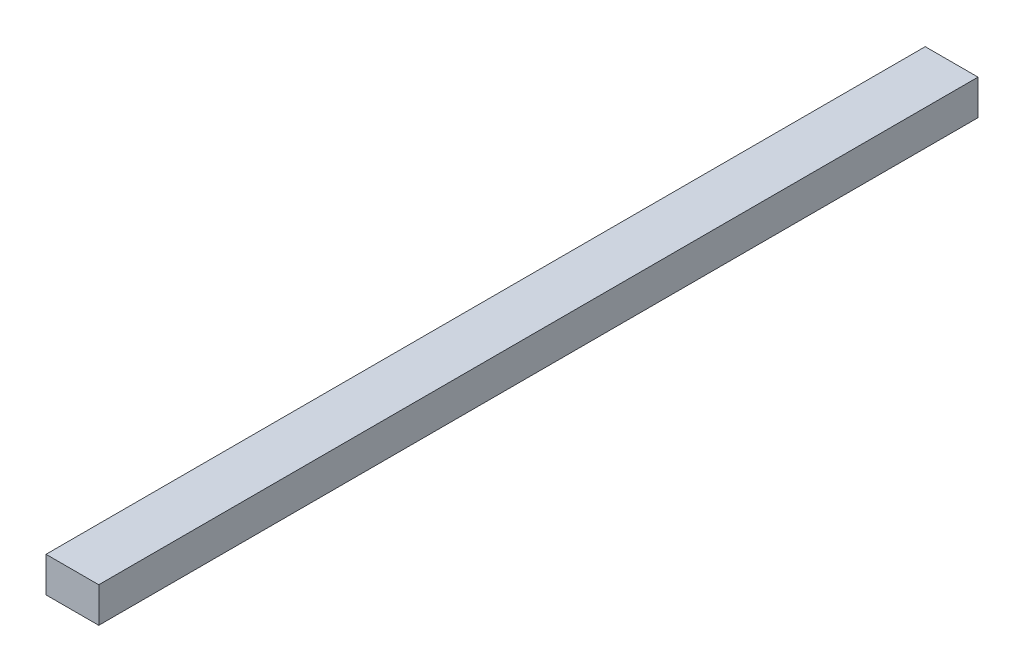
ISO-10303-21;
HEADER;
FILE_DESCRIPTION(('STEP AP214'),'2;1');
FILE_NAME('part.step','',(''),(''),'','','');
FILE_SCHEMA(('AUTOMOTIVE_DESIGN { 1 0 10303 214 1 1 1 1 }'));
ENDSEC;
DATA;
#1=APPLICATION_CONTEXT('core data for automotive mechanical design processes');
#2=APPLICATION_PROTOCOL_DEFINITION('international standard','automotive_design',2000,#1);
#3=PRODUCT_CONTEXT('',#1,'mechanical');
#4=PRODUCT('Part','Part','',(#3));
#5=PRODUCT_RELATED_PRODUCT_CATEGORY('part','',(#4));
#6=PRODUCT_DEFINITION_FORMATION('','',#4);
#7=PRODUCT_DEFINITION_CONTEXT('part definition',#1,'design');
#8=PRODUCT_DEFINITION('design','',#6,#7);
#9=PRODUCT_DEFINITION_SHAPE('','',#8);
#10=(LENGTH_UNIT() NAMED_UNIT(*) SI_UNIT(.MILLI.,.METRE.));
#11=(NAMED_UNIT(*) PLANE_ANGLE_UNIT() SI_UNIT($,.RADIAN.));
#12=(NAMED_UNIT(*) SI_UNIT($,.STERADIAN.) SOLID_ANGLE_UNIT());
#13=UNCERTAINTY_MEASURE_WITH_UNIT(LENGTH_MEASURE(1.E-05),#10,'distance_accuracy_value','');
#14=(GEOMETRIC_REPRESENTATION_CONTEXT(3) GLOBAL_UNCERTAINTY_ASSIGNED_CONTEXT((#13)) GLOBAL_UNIT_ASSIGNED_CONTEXT((#10,
#11,#12)) REPRESENTATION_CONTEXT('',''));
#15=CARTESIAN_POINT('',(0.,0.,0.));
#16=DIRECTION('',(0.,0.,1.));
#17=DIRECTION('',(1.,0.,0.));
#18=AXIS2_PLACEMENT_3D('',#15,#16,#17);
#19=CARTESIAN_POINT('',(-11.1196129400688,6.96774193548387,500.));
#20=DIRECTION('',(1.,0.,0.));
#21=DIRECTION('',(0.,1.,0.));
#22=AXIS2_PLACEMENT_3D('',#19,#20,#21);
#23=PLANE('',#22);
#24=DIRECTION('',(0.,-1.,0.));
#25=VECTOR('',#24,1.);
#26=CARTESIAN_POINT('',(-11.1196129400688,6.96774193548387,0.));
#27=LINE('',#26,#25);
#28=CARTESIAN_POINT('',(-11.1196129400688,6.96774193548387,0.));
#29=VERTEX_POINT('',#28);
#30=CARTESIAN_POINT('',(-11.1196129400688,-13.0322580645161,0.));
#31=VERTEX_POINT('',#30);
#32=EDGE_CURVE('E107',#29,#31,#27,.T.);
#33=ORIENTED_EDGE('',*,*,#32,.T.);
#34=DIRECTION('',(0.,0.,-1.));
#35=VECTOR('',#34,1.);
#36=CARTESIAN_POINT('',(-11.1196129400688,-13.0322580645161,500.));
#37=LINE('',#36,#35);
#38=CARTESIAN_POINT('',(-11.1196129400688,-13.0322580645161,500.));
#39=VERTEX_POINT('',#38);
#40=EDGE_CURVE('E11',#39,#31,#37,.T.);
#41=ORIENTED_EDGE('',*,*,#40,.F.);
#42=DIRECTION('',(0.,-1.,0.));
#43=VECTOR('',#42,1.);
#44=CARTESIAN_POINT('',(-11.1196129400688,6.96774193548387,500.));
#45=LINE('',#44,#43);
#46=CARTESIAN_POINT('',(-11.1196129400688,6.96774193548387,500.));
#47=VERTEX_POINT('',#46);
#48=EDGE_CURVE('E91',#47,#39,#45,.T.);
#49=ORIENTED_EDGE('',*,*,#48,.F.);
#50=DIRECTION('',(0.,0.,-1.));
#51=VECTOR('',#50,1.);
#52=CARTESIAN_POINT('',(-11.1196129400688,6.96774193548387,500.));
#53=LINE('',#52,#51);
#54=EDGE_CURVE('E103',#47,#29,#53,.T.);
#55=ORIENTED_EDGE('',*,*,#54,.T.);
#56=EDGE_LOOP('',(#33,#41,#49,#55));
#57=FACE_BOUND('',#56,.T.);
#58=ADVANCED_FACE('F39',(#57),#23,.F.);
#59=CARTESIAN_POINT('',(-11.1196129400688,-13.0322580645161,500.));
#60=DIRECTION('',(0.,1.,0.));
#61=DIRECTION('',(0.,0.,1.));
#62=AXIS2_PLACEMENT_3D('',#59,#60,#61);
#63=PLANE('',#62);
#64=DIRECTION('',(1.,0.,0.));
#65=VECTOR('',#64,1.);
#66=CARTESIAN_POINT('',(-11.1196129400688,-13.0322580645161,0.));
#67=LINE('',#66,#65);
#68=CARTESIAN_POINT('',(18.8803870599312,-13.0322580645161,0.));
#69=VERTEX_POINT('',#68);
#70=EDGE_CURVE('E96',#31,#69,#67,.T.);
#71=ORIENTED_EDGE('',*,*,#70,.T.);
#72=DIRECTION('',(0.,0.,-1.));
#73=VECTOR('',#72,1.);
#74=CARTESIAN_POINT('',(18.8803870599312,-13.0322580645161,500.));
#75=LINE('',#74,#73);
#76=CARTESIAN_POINT('',(18.8803870599312,-13.0322580645161,500.));
#77=VERTEX_POINT('',#76);
#78=EDGE_CURVE('E48',#77,#69,#75,.T.);
#79=ORIENTED_EDGE('',*,*,#78,.F.);
#80=DIRECTION('',(1.,0.,0.));
#81=VECTOR('',#80,1.);
#82=CARTESIAN_POINT('',(-11.1196129400688,-13.0322580645161,500.));
#83=LINE('',#82,#81);
#84=EDGE_CURVE('E86',#39,#77,#83,.T.);
#85=ORIENTED_EDGE('',*,*,#84,.F.);
#86=ORIENTED_EDGE('',*,*,#40,.T.);
#87=EDGE_LOOP('',(#71,#79,#85,#86));
#88=FACE_BOUND('',#87,.T.);
#89=ADVANCED_FACE('F95',(#88),#63,.F.);
#90=CARTESIAN_POINT('',(18.8803870599312,6.96774193548387,500.));
#91=DIRECTION('',(-1.,0.,0.));
#92=DIRECTION('',(0.,-1.,0.));
#93=AXIS2_PLACEMENT_3D('',#90,#91,#92);
#94=PLANE('',#93);
#95=DIRECTION('',(0.,1.,0.));
#96=VECTOR('',#95,1.);
#97=CARTESIAN_POINT('',(18.8803870599312,6.96774193548387,0.));
#98=LINE('',#97,#96);
#99=CARTESIAN_POINT('',(18.8803870599312,6.96774193548387,0.));
#100=VERTEX_POINT('',#99);
#101=EDGE_CURVE('E73',#69,#100,#98,.T.);
#102=ORIENTED_EDGE('',*,*,#101,.T.);
#103=DIRECTION('',(0.,0.,-1.));
#104=VECTOR('',#103,1.);
#105=CARTESIAN_POINT('',(18.8803870599312,6.96774193548387,500.));
#106=LINE('',#105,#104);
#107=CARTESIAN_POINT('',(18.8803870599312,6.96774193548387,500.));
#108=VERTEX_POINT('',#107);
#109=EDGE_CURVE('E98',#108,#100,#106,.T.);
#110=ORIENTED_EDGE('',*,*,#109,.F.);
#111=DIRECTION('',(0.,1.,0.));
#112=VECTOR('',#111,1.);
#113=CARTESIAN_POINT('',(18.8803870599312,6.96774193548387,500.));
#114=LINE('',#113,#112);
#115=EDGE_CURVE('E89',#77,#108,#114,.T.);
#116=ORIENTED_EDGE('',*,*,#115,.F.);
#117=ORIENTED_EDGE('',*,*,#78,.T.);
#118=EDGE_LOOP('',(#102,#110,#116,#117));
#119=FACE_BOUND('',#118,.T.);
#120=ADVANCED_FACE('F99',(#119),#94,.F.);
#121=CARTESIAN_POINT('',(-11.1196129400688,6.96774193548387,500.));
#122=DIRECTION('',(0.,-1.,0.));
#123=DIRECTION('',(0.,0.,-1.));
#124=AXIS2_PLACEMENT_3D('',#121,#122,#123);
#125=PLANE('',#124);
#126=DIRECTION('',(-1.,0.,0.));
#127=VECTOR('',#126,1.);
#128=CARTESIAN_POINT('',(-11.1196129400688,6.96774193548387,0.));
#129=LINE('',#128,#127);
#130=EDGE_CURVE('E79',#100,#29,#129,.T.);
#131=ORIENTED_EDGE('',*,*,#130,.T.);
#132=ORIENTED_EDGE('',*,*,#54,.F.);
#133=DIRECTION('',(-1.,0.,0.));
#134=VECTOR('',#133,1.);
#135=CARTESIAN_POINT('',(-11.1196129400688,6.96774193548387,500.));
#136=LINE('',#135,#134);
#137=EDGE_CURVE('E56',#108,#47,#136,.T.);
#138=ORIENTED_EDGE('',*,*,#137,.F.);
#139=ORIENTED_EDGE('',*,*,#109,.T.);
#140=EDGE_LOOP('',(#131,#132,#138,#139));
#141=FACE_BOUND('',#140,.T.);
#142=ADVANCED_FACE('F120',(#141),#125,.F.);
#143=CARTESIAN_POINT('',(0.,0.,500.));
#144=DIRECTION('',(0.,0.,1.));
#145=DIRECTION('',(1.,0.,0.));
#146=AXIS2_PLACEMENT_3D('',#143,#144,#145);
#147=PLANE('',#146);
#148=ORIENTED_EDGE('',*,*,#48,.T.);
#149=ORIENTED_EDGE('',*,*,#84,.T.);
#150=ORIENTED_EDGE('',*,*,#115,.T.);
#151=ORIENTED_EDGE('',*,*,#137,.T.);
#152=EDGE_LOOP('',(#148,#149,#150,#151));
#153=FACE_BOUND('',#152,.T.);
#154=ADVANCED_FACE('F87',(#153),#147,.T.);
#155=CARTESIAN_POINT('',(0.,0.,0.));
#156=DIRECTION('',(0.,0.,1.));
#157=DIRECTION('',(1.,0.,0.));
#158=AXIS2_PLACEMENT_3D('',#155,#156,#157);
#159=PLANE('',#158);
#160=ORIENTED_EDGE('',*,*,#32,.F.);
#161=ORIENTED_EDGE('',*,*,#130,.F.);
#162=ORIENTED_EDGE('',*,*,#101,.F.);
#163=ORIENTED_EDGE('',*,*,#70,.F.);
#164=EDGE_LOOP('',(#160,#161,#162,#163));
#165=FACE_BOUND('',#164,.T.);
#166=ADVANCED_FACE('F123',(#165),#159,.F.);
#167=CLOSED_SHELL('',(#58,#89,#120,#142,#154,#166));
#168=MANIFOLD_SOLID_BREP('B2',#167);
#169=ADVANCED_BREP_SHAPE_REPRESENTATION('',(#18,#168),#14);
#170=SHAPE_DEFINITION_REPRESENTATION(#9,#169);
ENDSEC;
END-ISO-10303-21;
